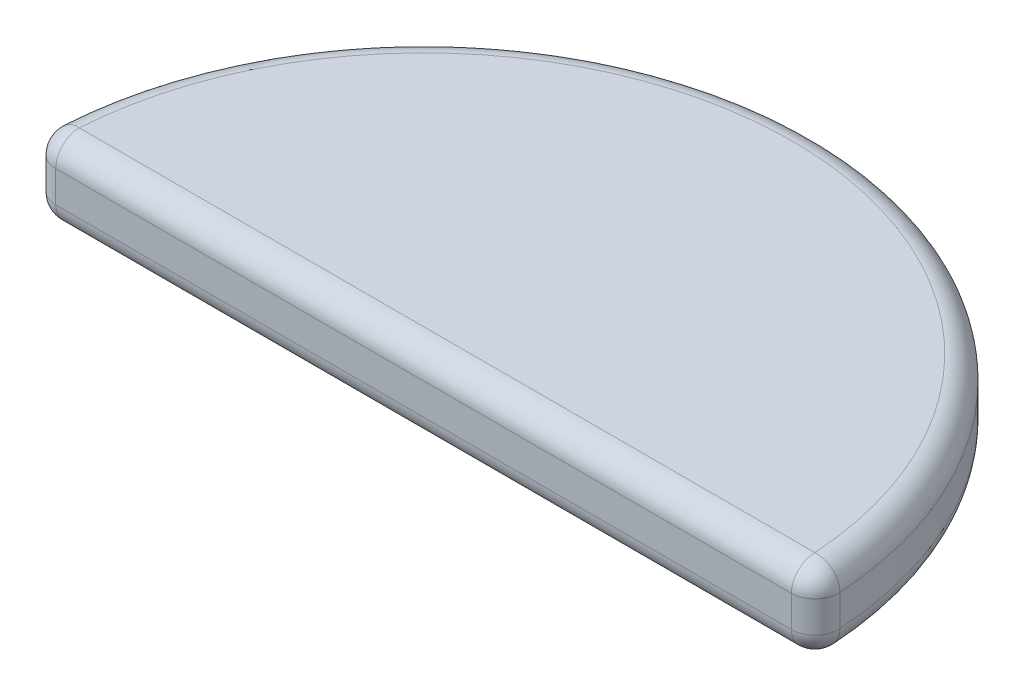
ISO-10303-21;
HEADER;
FILE_DESCRIPTION(('STEP AP214'),'2;1');
FILE_NAME('part.step','',(''),(''),'','','');
FILE_SCHEMA(('AUTOMOTIVE_DESIGN { 1 0 10303 214 1 1 1 1 }'));
ENDSEC;
DATA;
#1=APPLICATION_CONTEXT('core data for automotive mechanical design processes');
#2=APPLICATION_PROTOCOL_DEFINITION('international standard','automotive_design',2000,#1);
#3=PRODUCT_CONTEXT('',#1,'mechanical');
#4=PRODUCT('Part','Part','',(#3));
#5=PRODUCT_RELATED_PRODUCT_CATEGORY('part','',(#4));
#6=PRODUCT_DEFINITION_FORMATION('','',#4);
#7=PRODUCT_DEFINITION_CONTEXT('part definition',#1,'design');
#8=PRODUCT_DEFINITION('design','',#6,#7);
#9=PRODUCT_DEFINITION_SHAPE('','',#8);
#10=(LENGTH_UNIT() NAMED_UNIT(*) SI_UNIT(.MILLI.,.METRE.));
#11=(NAMED_UNIT(*) PLANE_ANGLE_UNIT() SI_UNIT($,.RADIAN.));
#12=(NAMED_UNIT(*) SI_UNIT($,.STERADIAN.) SOLID_ANGLE_UNIT());
#13=UNCERTAINTY_MEASURE_WITH_UNIT(LENGTH_MEASURE(1.E-05),#10,'distance_accuracy_value','');
#14=(GEOMETRIC_REPRESENTATION_CONTEXT(3) GLOBAL_UNCERTAINTY_ASSIGNED_CONTEXT((#13)) GLOBAL_UNIT_ASSIGNED_CONTEXT((#10,
#11,#12)) REPRESENTATION_CONTEXT('',''));
#15=CARTESIAN_POINT('',(0.,0.,0.));
#16=DIRECTION('',(0.,0.,1.));
#17=DIRECTION('',(1.,0.,0.));
#18=AXIS2_PLACEMENT_3D('',#15,#16,#17);
#19=CARTESIAN_POINT('',(500.,100.,0.));
#20=DIRECTION('',(0.,-1.,0.));
#21=DIRECTION('',(0.,0.,-1.));
#22=AXIS2_PLACEMENT_3D('',#19,#20,#21);
#23=CYLINDRICAL_SURFACE('',#22,500.);
#24=DIRECTION('',(0.,-1.,0.));
#25=VECTOR('',#24,1.);
#26=CARTESIAN_POINT('',(998.980399981216,100.,-31.9148936170213));
#27=LINE('',#26,#25);
#28=CARTESIAN_POINT('',(998.980399981216,70.,-31.9148936170213));
#29=VERTEX_POINT('',#28);
#30=CARTESIAN_POINT('',(998.980399981216,30.,-31.9148936170213));
#31=VERTEX_POINT('',#30);
#32=EDGE_CURVE('E105',#29,#31,#27,.T.);
#33=ORIENTED_EDGE('',*,*,#32,.T.);
#34=CARTESIAN_POINT('',(500.,30.,0.));
#35=DIRECTION('',(0.,-1.,0.));
#36=DIRECTION('',(0.,0.,-1.));
#37=AXIS2_PLACEMENT_3D('',#34,#35,#36);
#38=CIRCLE('',#37,500.);
#39=CARTESIAN_POINT('',(1.01960001878404,30.,-31.9148936170213));
#40=VERTEX_POINT('',#39);
#41=EDGE_CURVE('E100',#31,#40,#38,.F.);
#42=ORIENTED_EDGE('',*,*,#41,.T.);
#43=DIRECTION('',(0.,-1.,0.));
#44=VECTOR('',#43,1.);
#45=CARTESIAN_POINT('',(1.01960001878404,100.,-31.9148936170213));
#46=LINE('',#45,#44);
#47=CARTESIAN_POINT('',(1.01960001878404,70.,-31.9148936170213));
#48=VERTEX_POINT('',#47);
#49=EDGE_CURVE('E96',#40,#48,#46,.F.);
#50=ORIENTED_EDGE('',*,*,#49,.T.);
#51=CARTESIAN_POINT('',(500.,70.,0.));
#52=DIRECTION('',(0.,-1.,0.));
#53=DIRECTION('',(0.,0.,-1.));
#54=AXIS2_PLACEMENT_3D('',#51,#52,#53);
#55=CIRCLE('',#54,500.);
#56=EDGE_CURVE('E98',#48,#29,#55,.T.);
#57=ORIENTED_EDGE('',*,*,#56,.T.);
#58=EDGE_LOOP('',(#33,#42,#50,#57));
#59=FACE_BOUND('',#58,.T.);
#60=ADVANCED_FACE('F39',(#59),#23,.T.);
#61=CARTESIAN_POINT('',(0.,100.,0.));
#62=DIRECTION('',(0.,0.,-1.));
#63=DIRECTION('',(-1.,0.,0.));
#64=AXIS2_PLACEMENT_3D('',#61,#62,#63);
#65=PLANE('',#64);
#66=DIRECTION('',(0.,-1.,0.));
#67=VECTOR('',#66,1.);
#68=CARTESIAN_POINT('',(30.9584240176571,100.,0.));
#69=LINE('',#68,#67);
#70=CARTESIAN_POINT('',(30.9584240176571,70.,0.));
#71=VERTEX_POINT('',#70);
#72=CARTESIAN_POINT('',(30.9584240176571,30.,0.));
#73=VERTEX_POINT('',#72);
#74=EDGE_CURVE('E125',#71,#73,#69,.T.);
#75=ORIENTED_EDGE('',*,*,#74,.T.);
#76=DIRECTION('',(1.,0.,0.));
#77=VECTOR('',#76,1.);
#78=CARTESIAN_POINT('',(1000.,30.,0.));
#79=LINE('',#78,#77);
#80=CARTESIAN_POINT('',(969.041575982343,30.,0.));
#81=VERTEX_POINT('',#80);
#82=EDGE_CURVE('E173',#73,#81,#79,.T.);
#83=ORIENTED_EDGE('',*,*,#82,.T.);
#84=DIRECTION('',(0.,-1.,0.));
#85=VECTOR('',#84,1.);
#86=CARTESIAN_POINT('',(969.041575982343,100.,0.));
#87=LINE('',#86,#85);
#88=CARTESIAN_POINT('',(969.041575982343,70.,0.));
#89=VERTEX_POINT('',#88);
#90=EDGE_CURVE('E150',#81,#89,#87,.F.);
#91=ORIENTED_EDGE('',*,*,#90,.T.);
#92=DIRECTION('',(1.,0.,0.));
#93=VECTOR('',#92,1.);
#94=CARTESIAN_POINT('',(0.,70.,0.));
#95=LINE('',#94,#93);
#96=EDGE_CURVE('E166',#89,#71,#95,.F.);
#97=ORIENTED_EDGE('',*,*,#96,.T.);
#98=EDGE_LOOP('',(#75,#83,#91,#97));
#99=FACE_BOUND('',#98,.T.);
#100=ADVANCED_FACE('F205',(#99),#65,.F.);
#101=CARTESIAN_POINT('',(500.,100.,0.));
#102=DIRECTION('',(0.,-1.,0.));
#103=DIRECTION('',(0.,0.,-1.));
#104=AXIS2_PLACEMENT_3D('',#101,#102,#103);
#105=PLANE('',#104);
#106=CARTESIAN_POINT('',(500.,100.,0.));
#107=DIRECTION('',(0.,-1.,0.));
#108=DIRECTION('',(0.,0.,-1.));
#109=AXIS2_PLACEMENT_3D('',#106,#107,#108);
#110=CIRCLE('',#109,470.);
#111=CARTESIAN_POINT('',(969.041575982343,100.,-30.));
#112=VERTEX_POINT('',#111);
#113=CARTESIAN_POINT('',(30.9584240176571,100.,-30.));
#114=VERTEX_POINT('',#113);
#115=EDGE_CURVE('E49',#112,#114,#110,.F.);
#116=ORIENTED_EDGE('',*,*,#115,.T.);
#117=DIRECTION('',(1.,0.,0.));
#118=VECTOR('',#117,1.);
#119=CARTESIAN_POINT('',(500.,100.,-30.));
#120=LINE('',#119,#118);
#121=EDGE_CURVE('E11',#114,#112,#120,.T.);
#122=ORIENTED_EDGE('',*,*,#121,.T.);
#123=EDGE_LOOP('',(#116,#122));
#124=FACE_BOUND('',#123,.T.);
#125=ADVANCED_FACE('F207',(#124),#105,.F.);
#126=CARTESIAN_POINT('',(500.,0.,0.));
#127=DIRECTION('',(0.,-1.,0.));
#128=DIRECTION('',(0.,0.,-1.));
#129=AXIS2_PLACEMENT_3D('',#126,#127,#128);
#130=PLANE('',#129);
#131=DIRECTION('',(1.,0.,0.));
#132=VECTOR('',#131,1.);
#133=CARTESIAN_POINT('',(0.,0.,-30.));
#134=LINE('',#133,#132);
#135=CARTESIAN_POINT('',(969.041575982343,0.,-30.));
#136=VERTEX_POINT('',#135);
#137=CARTESIAN_POINT('',(30.9584240176571,0.,-30.));
#138=VERTEX_POINT('',#137);
#139=EDGE_CURVE('E159',#136,#138,#134,.F.);
#140=ORIENTED_EDGE('',*,*,#139,.T.);
#141=CARTESIAN_POINT('',(500.,0.,0.));
#142=DIRECTION('',(0.,-1.,0.));
#143=DIRECTION('',(0.,0.,-1.));
#144=AXIS2_PLACEMENT_3D('',#141,#142,#143);
#145=CIRCLE('',#144,470.);
#146=EDGE_CURVE('E162',#138,#136,#145,.T.);
#147=ORIENTED_EDGE('',*,*,#146,.T.);
#148=EDGE_LOOP('',(#140,#147));
#149=FACE_BOUND('',#148,.T.);
#150=ADVANCED_FACE('F209',(#149),#130,.T.);
#151=CARTESIAN_POINT('',(500.,70.,0.));
#152=DIRECTION('',(0.,-1.,0.));
#153=DIRECTION('',(0.,0.,-1.));
#154=AXIS2_PLACEMENT_3D('',#151,#152,#153);
#155=TOROIDAL_SURFACE('',#154,470.,30.);
#156=CARTESIAN_POINT('',(30.9584240176571,70.,-30.));
#157=DIRECTION('',(-0.0638297872340425,0.,0.997960799962432));
#158=DIRECTION('',(0.997960799962432,0.,0.0638297872340425));
#159=AXIS2_PLACEMENT_3D('',#156,#157,#158);
#160=CIRCLE('',#159,30.);
#161=EDGE_CURVE('E110',#114,#48,#160,.T.);
#162=ORIENTED_EDGE('',*,*,#161,.F.);
#163=ORIENTED_EDGE('',*,*,#115,.F.);
#164=CARTESIAN_POINT('',(969.041575982343,70.,-30.));
#165=DIRECTION('',(0.0638297872340425,0.,0.997960799962432));
#166=DIRECTION('',(0.997960799962432,0.,-0.0638297872340425));
#167=AXIS2_PLACEMENT_3D('',#164,#165,#166);
#168=CIRCLE('',#167,30.);
#169=EDGE_CURVE('E62',#29,#112,#168,.T.);
#170=ORIENTED_EDGE('',*,*,#169,.F.);
#171=ORIENTED_EDGE('',*,*,#56,.F.);
#172=EDGE_LOOP('',(#162,#163,#170,#171));
#173=FACE_BOUND('',#172,.T.);
#174=ADVANCED_FACE('F41',(#173),#155,.T.);
#175=CARTESIAN_POINT('',(500.,70.,-30.));
#176=DIRECTION('',(1.,0.,0.));
#177=DIRECTION('',(0.,0.,-1.));
#178=AXIS2_PLACEMENT_3D('',#175,#176,#177);
#179=CYLINDRICAL_SURFACE('',#178,30.);
#180=CARTESIAN_POINT('',(969.041575982343,70.,-30.));
#181=DIRECTION('',(1.,0.,0.));
#182=DIRECTION('',(0.,0.,-1.));
#183=AXIS2_PLACEMENT_3D('',#180,#181,#182);
#184=CIRCLE('',#183,30.);
#185=EDGE_CURVE('E43',#112,#89,#184,.T.);
#186=ORIENTED_EDGE('',*,*,#185,.F.);
#187=ORIENTED_EDGE('',*,*,#121,.F.);
#188=CARTESIAN_POINT('',(30.9584240176571,70.,-30.));
#189=DIRECTION('',(-1.,0.,0.));
#190=DIRECTION('',(0.,-1.,0.));
#191=AXIS2_PLACEMENT_3D('',#188,#189,#190);
#192=CIRCLE('',#191,30.);
#193=EDGE_CURVE('E120',#71,#114,#192,.T.);
#194=ORIENTED_EDGE('',*,*,#193,.F.);
#195=ORIENTED_EDGE('',*,*,#96,.F.);
#196=EDGE_LOOP('',(#186,#187,#194,#195));
#197=FACE_BOUND('',#196,.T.);
#198=ADVANCED_FACE('F206',(#197),#179,.T.);
#199=CARTESIAN_POINT('',(969.041575982343,70.,-30.));
#200=DIRECTION('',(0.,0.,1.));
#201=DIRECTION('',(1.,0.,0.));
#202=AXIS2_PLACEMENT_3D('',#199,#200,#201);
#203=SPHERICAL_SURFACE('',#202,30.);
#204=ORIENTED_EDGE('',*,*,#169,.T.);
#205=ORIENTED_EDGE('',*,*,#185,.T.);
#206=CARTESIAN_POINT('',(969.041575982343,70.,-30.));
#207=DIRECTION('',(0.,1.,0.));
#208=DIRECTION('',(0.,0.,1.));
#209=AXIS2_PLACEMENT_3D('',#206,#207,#208);
#210=CIRCLE('',#209,30.);
#211=EDGE_CURVE('E127',#29,#89,#210,.F.);
#212=ORIENTED_EDGE('',*,*,#211,.F.);
#213=EDGE_LOOP('',(#204,#205,#212));
#214=FACE_BOUND('',#213,.T.);
#215=ADVANCED_FACE('F142',(#214),#203,.T.);
#216=CARTESIAN_POINT('',(30.9584240176571,70.,-30.));
#217=DIRECTION('',(0.,0.,1.));
#218=DIRECTION('',(1.,0.,0.));
#219=AXIS2_PLACEMENT_3D('',#216,#217,#218);
#220=SPHERICAL_SURFACE('',#219,30.);
#221=ORIENTED_EDGE('',*,*,#193,.T.);
#222=ORIENTED_EDGE('',*,*,#161,.T.);
#223=CARTESIAN_POINT('',(30.958424017657,70.,-30.));
#224=DIRECTION('',(0.,1.,0.));
#225=DIRECTION('',(0.,0.,1.));
#226=AXIS2_PLACEMENT_3D('',#223,#224,#225);
#227=CIRCLE('',#226,30.);
#228=EDGE_CURVE('E117',#71,#48,#227,.F.);
#229=ORIENTED_EDGE('',*,*,#228,.F.);
#230=EDGE_LOOP('',(#221,#222,#229));
#231=FACE_BOUND('',#230,.T.);
#232=ADVANCED_FACE('F116',(#231),#220,.T.);
#233=CARTESIAN_POINT('',(969.041575982343,100.,-30.));
#234=DIRECTION('',(0.,-1.,0.));
#235=DIRECTION('',(0.,0.,-1.));
#236=AXIS2_PLACEMENT_3D('',#233,#234,#235);
#237=CYLINDRICAL_SURFACE('',#236,30.);
#238=ORIENTED_EDGE('',*,*,#211,.T.);
#239=ORIENTED_EDGE('',*,*,#90,.F.);
#240=CARTESIAN_POINT('',(969.041575982343,30.,-30.));
#241=DIRECTION('',(0.,-1.,0.));
#242=DIRECTION('',(0.,0.,-1.));
#243=AXIS2_PLACEMENT_3D('',#240,#241,#242);
#244=CIRCLE('',#243,30.);
#245=EDGE_CURVE('E135',#31,#81,#244,.T.);
#246=ORIENTED_EDGE('',*,*,#245,.F.);
#247=ORIENTED_EDGE('',*,*,#32,.F.);
#248=EDGE_LOOP('',(#238,#239,#246,#247));
#249=FACE_BOUND('',#248,.T.);
#250=ADVANCED_FACE('F148',(#249),#237,.T.);
#251=CARTESIAN_POINT('',(30.9584240176571,100.,-30.));
#252=DIRECTION('',(0.,-1.,0.));
#253=DIRECTION('',(0.,0.,-1.));
#254=AXIS2_PLACEMENT_3D('',#251,#252,#253);
#255=CYLINDRICAL_SURFACE('',#254,30.);
#256=ORIENTED_EDGE('',*,*,#228,.T.);
#257=ORIENTED_EDGE('',*,*,#49,.F.);
#258=CARTESIAN_POINT('',(30.9584240176571,30.,-30.));
#259=DIRECTION('',(0.,-1.,0.));
#260=DIRECTION('',(0.,0.,-1.));
#261=AXIS2_PLACEMENT_3D('',#258,#259,#260);
#262=CIRCLE('',#261,30.);
#263=EDGE_CURVE('E187',#73,#40,#262,.T.);
#264=ORIENTED_EDGE('',*,*,#263,.F.);
#265=ORIENTED_EDGE('',*,*,#74,.F.);
#266=EDGE_LOOP('',(#256,#257,#264,#265));
#267=FACE_BOUND('',#266,.T.);
#268=ADVANCED_FACE('F123',(#267),#255,.T.);
#269=CARTESIAN_POINT('',(0.,30.,-30.));
#270=DIRECTION('',(-1.,0.,0.));
#271=DIRECTION('',(0.,0.,1.));
#272=AXIS2_PLACEMENT_3D('',#269,#270,#271);
#273=CYLINDRICAL_SURFACE('',#272,30.);
#274=CARTESIAN_POINT('',(969.041575982343,30.,-30.));
#275=DIRECTION('',(1.,0.,0.));
#276=DIRECTION('',(0.,1.,0.));
#277=AXIS2_PLACEMENT_3D('',#274,#275,#276);
#278=CIRCLE('',#277,30.);
#279=EDGE_CURVE('E128',#81,#136,#278,.T.);
#280=ORIENTED_EDGE('',*,*,#279,.F.);
#281=ORIENTED_EDGE('',*,*,#82,.F.);
#282=CARTESIAN_POINT('',(30.9584240176571,30.,-30.));
#283=DIRECTION('',(-1.,0.,0.));
#284=DIRECTION('',(0.,0.,1.));
#285=AXIS2_PLACEMENT_3D('',#282,#283,#284);
#286=CIRCLE('',#285,30.);
#287=EDGE_CURVE('E184',#138,#73,#286,.T.);
#288=ORIENTED_EDGE('',*,*,#287,.F.);
#289=ORIENTED_EDGE('',*,*,#139,.F.);
#290=EDGE_LOOP('',(#280,#281,#288,#289));
#291=FACE_BOUND('',#290,.T.);
#292=ADVANCED_FACE('F203',(#291),#273,.T.);
#293=CARTESIAN_POINT('',(969.041575982343,30.,-30.));
#294=DIRECTION('',(0.,0.,1.));
#295=DIRECTION('',(1.,0.,0.));
#296=AXIS2_PLACEMENT_3D('',#293,#294,#295);
#297=SPHERICAL_SURFACE('',#296,30.);
#298=ORIENTED_EDGE('',*,*,#245,.T.);
#299=ORIENTED_EDGE('',*,*,#279,.T.);
#300=CARTESIAN_POINT('',(969.041575982343,30.,-30.));
#301=DIRECTION('',(0.0638297872340423,0.,0.997960799962432));
#302=DIRECTION('',(0.997960799962432,0.,-0.0638297872340423));
#303=AXIS2_PLACEMENT_3D('',#300,#301,#302);
#304=CIRCLE('',#303,30.);
#305=EDGE_CURVE('E181',#31,#136,#304,.F.);
#306=ORIENTED_EDGE('',*,*,#305,.F.);
#307=EDGE_LOOP('',(#298,#299,#306));
#308=FACE_BOUND('',#307,.T.);
#309=ADVANCED_FACE('F192',(#308),#297,.T.);
#310=CARTESIAN_POINT('',(30.9584240176571,30.,-30.));
#311=DIRECTION('',(0.,0.,1.));
#312=DIRECTION('',(1.,0.,0.));
#313=AXIS2_PLACEMENT_3D('',#310,#311,#312);
#314=SPHERICAL_SURFACE('',#313,30.);
#315=ORIENTED_EDGE('',*,*,#287,.T.);
#316=ORIENTED_EDGE('',*,*,#263,.T.);
#317=CARTESIAN_POINT('',(30.958424017657,30.,-30.));
#318=DIRECTION('',(-0.0638297872340425,0.,0.997960799962432));
#319=DIRECTION('',(0.997960799962432,0.,0.0638297872340425));
#320=AXIS2_PLACEMENT_3D('',#317,#318,#319);
#321=CIRCLE('',#320,30.);
#322=EDGE_CURVE('E178',#138,#40,#321,.F.);
#323=ORIENTED_EDGE('',*,*,#322,.F.);
#324=EDGE_LOOP('',(#315,#316,#323));
#325=FACE_BOUND('',#324,.T.);
#326=ADVANCED_FACE('F199',(#325),#314,.T.);
#327=CARTESIAN_POINT('',(500.,30.,0.));
#328=DIRECTION('',(0.,-1.,0.));
#329=DIRECTION('',(0.,0.,-1.));
#330=AXIS2_PLACEMENT_3D('',#327,#328,#329);
#331=TOROIDAL_SURFACE('',#330,470.,30.);
#332=ORIENTED_EDGE('',*,*,#305,.T.);
#333=ORIENTED_EDGE('',*,*,#146,.F.);
#334=ORIENTED_EDGE('',*,*,#322,.T.);
#335=ORIENTED_EDGE('',*,*,#41,.F.);
#336=EDGE_LOOP('',(#332,#333,#334,#335));
#337=FACE_BOUND('',#336,.T.);
#338=ADVANCED_FACE('F196',(#337),#331,.T.);
#339=CLOSED_SHELL('',(#60,#100,#125,#150,#174,#198,#215,#232,#250,#268,#292,#309,#326,#338));
#340=MANIFOLD_SOLID_BREP('B2',#339);
#341=ADVANCED_BREP_SHAPE_REPRESENTATION('',(#18,#340),#14);
#342=SHAPE_DEFINITION_REPRESENTATION(#9,#341);
ENDSEC;
END-ISO-10303-21;
